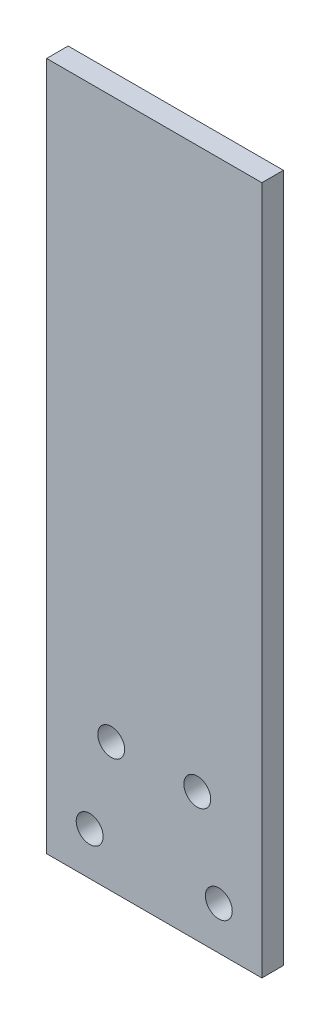
ISO-10303-21;
HEADER;
FILE_DESCRIPTION(('STEP AP214'),'2;1');
FILE_NAME('part.step','',(''),(''),'','','');
FILE_SCHEMA(('AUTOMOTIVE_DESIGN { 1 0 10303 214 1 1 1 1 }'));
ENDSEC;
DATA;
#1=APPLICATION_CONTEXT('core data for automotive mechanical design processes');
#2=APPLICATION_PROTOCOL_DEFINITION('international standard','automotive_design',2000,#1);
#3=PRODUCT_CONTEXT('',#1,'mechanical');
#4=PRODUCT('Part','Part','',(#3));
#5=PRODUCT_RELATED_PRODUCT_CATEGORY('part','',(#4));
#6=PRODUCT_DEFINITION_FORMATION('','',#4);
#7=PRODUCT_DEFINITION_CONTEXT('part definition',#1,'design');
#8=PRODUCT_DEFINITION('design','',#6,#7);
#9=PRODUCT_DEFINITION_SHAPE('','',#8);
#10=(LENGTH_UNIT() NAMED_UNIT(*) SI_UNIT(.MILLI.,.METRE.));
#11=(NAMED_UNIT(*) PLANE_ANGLE_UNIT() SI_UNIT($,.RADIAN.));
#12=(NAMED_UNIT(*) SI_UNIT($,.STERADIAN.) SOLID_ANGLE_UNIT());
#13=UNCERTAINTY_MEASURE_WITH_UNIT(LENGTH_MEASURE(1.E-05),#10,'distance_accuracy_value','');
#14=(GEOMETRIC_REPRESENTATION_CONTEXT(3) GLOBAL_UNCERTAINTY_ASSIGNED_CONTEXT((#13)) GLOBAL_UNIT_ASSIGNED_CONTEXT((#10,
#11,#12)) REPRESENTATION_CONTEXT('',''));
#15=CARTESIAN_POINT('',(0.,0.,0.));
#16=DIRECTION('',(0.,0.,1.));
#17=DIRECTION('',(1.,0.,0.));
#18=AXIS2_PLACEMENT_3D('',#15,#16,#17);
#19=CARTESIAN_POINT('',(-31.75,-101.6,3.175));
#20=DIRECTION('',(0.,1.,0.));
#21=DIRECTION('',(0.,0.,1.));
#22=AXIS2_PLACEMENT_3D('',#19,#20,#21);
#23=PLANE('',#22);
#24=DIRECTION('',(1.,0.,0.));
#25=VECTOR('',#24,1.);
#26=CARTESIAN_POINT('',(-31.75,-101.6,-3.175));
#27=LINE('',#26,#25);
#28=CARTESIAN_POINT('',(-31.75,-101.6,-3.175));
#29=VERTEX_POINT('',#28);
#30=CARTESIAN_POINT('',(31.75,-101.6,-3.175));
#31=VERTEX_POINT('',#30);
#32=EDGE_CURVE('E99',#29,#31,#27,.T.);
#33=ORIENTED_EDGE('',*,*,#32,.T.);
#34=DIRECTION('',(0.,0.,-1.));
#35=VECTOR('',#34,1.);
#36=CARTESIAN_POINT('',(31.75,-101.6,3.175));
#37=LINE('',#36,#35);
#38=CARTESIAN_POINT('',(31.75,-101.6,3.175));
#39=VERTEX_POINT('',#38);
#40=EDGE_CURVE('E11',#39,#31,#37,.T.);
#41=ORIENTED_EDGE('',*,*,#40,.F.);
#42=DIRECTION('',(1.,0.,0.));
#43=VECTOR('',#42,1.);
#44=CARTESIAN_POINT('',(-31.75,-101.6,3.175));
#45=LINE('',#44,#43);
#46=CARTESIAN_POINT('',(-31.75,-101.6,3.175));
#47=VERTEX_POINT('',#46);
#48=EDGE_CURVE('E85',#47,#39,#45,.T.);
#49=ORIENTED_EDGE('',*,*,#48,.F.);
#50=DIRECTION('',(0.,0.,-1.));
#51=VECTOR('',#50,1.);
#52=CARTESIAN_POINT('',(-31.75,-101.6,3.175));
#53=LINE('',#52,#51);
#54=EDGE_CURVE('E52',#47,#29,#53,.T.);
#55=ORIENTED_EDGE('',*,*,#54,.T.);
#56=EDGE_LOOP('',(#33,#41,#49,#55));
#57=FACE_BOUND('',#56,.T.);
#58=ADVANCED_FACE('F36',(#57),#23,.F.);
#59=CARTESIAN_POINT('',(31.75,-101.6,3.175));
#60=DIRECTION('',(-1.,0.,0.));
#61=DIRECTION('',(0.,0.,1.));
#62=AXIS2_PLACEMENT_3D('',#59,#60,#61);
#63=PLANE('',#62);
#64=DIRECTION('',(0.,1.,0.));
#65=VECTOR('',#64,1.);
#66=CARTESIAN_POINT('',(31.75,-101.6,-3.175));
#67=LINE('',#66,#65);
#68=CARTESIAN_POINT('',(31.75,101.6,-3.175));
#69=VERTEX_POINT('',#68);
#70=EDGE_CURVE('E90',#31,#69,#67,.T.);
#71=ORIENTED_EDGE('',*,*,#70,.T.);
#72=DIRECTION('',(0.,0.,-1.));
#73=VECTOR('',#72,1.);
#74=CARTESIAN_POINT('',(31.75,101.6,3.175));
#75=LINE('',#74,#73);
#76=CARTESIAN_POINT('',(31.75,101.6,3.175));
#77=VERTEX_POINT('',#76);
#78=EDGE_CURVE('E44',#77,#69,#75,.T.);
#79=ORIENTED_EDGE('',*,*,#78,.F.);
#80=DIRECTION('',(0.,1.,0.));
#81=VECTOR('',#80,1.);
#82=CARTESIAN_POINT('',(31.75,-101.6,3.175));
#83=LINE('',#82,#81);
#84=EDGE_CURVE('E77',#39,#77,#83,.T.);
#85=ORIENTED_EDGE('',*,*,#84,.F.);
#86=ORIENTED_EDGE('',*,*,#40,.T.);
#87=EDGE_LOOP('',(#71,#79,#85,#86));
#88=FACE_BOUND('',#87,.T.);
#89=ADVANCED_FACE('F89',(#88),#63,.F.);
#90=CARTESIAN_POINT('',(-31.75,101.6,3.175));
#91=DIRECTION('',(0.,1.,0.));
#92=DIRECTION('',(0.,0.,1.));
#93=AXIS2_PLACEMENT_3D('',#90,#91,#92);
#94=PLANE('',#93);
#95=DIRECTION('',(1.,0.,0.));
#96=VECTOR('',#95,1.);
#97=CARTESIAN_POINT('',(-31.75,101.6,-3.175));
#98=LINE('',#97,#96);
#99=CARTESIAN_POINT('',(-31.75,101.6,-3.175));
#100=VERTEX_POINT('',#99);
#101=EDGE_CURVE('E103',#100,#69,#98,.T.);
#102=ORIENTED_EDGE('',*,*,#101,.F.);
#103=DIRECTION('',(0.,0.,-1.));
#104=VECTOR('',#103,1.);
#105=CARTESIAN_POINT('',(-31.75,101.6,3.175));
#106=LINE('',#105,#104);
#107=CARTESIAN_POINT('',(-31.75,101.6,3.175));
#108=VERTEX_POINT('',#107);
#109=EDGE_CURVE('E66',#108,#100,#106,.T.);
#110=ORIENTED_EDGE('',*,*,#109,.F.);
#111=DIRECTION('',(1.,0.,0.));
#112=VECTOR('',#111,1.);
#113=CARTESIAN_POINT('',(-31.75,101.6,3.175));
#114=LINE('',#113,#112);
#115=EDGE_CURVE('E84',#108,#77,#114,.T.);
#116=ORIENTED_EDGE('',*,*,#115,.T.);
#117=ORIENTED_EDGE('',*,*,#78,.T.);
#118=EDGE_LOOP('',(#102,#110,#116,#117));
#119=FACE_BOUND('',#118,.T.);
#120=ADVANCED_FACE('F93',(#119),#94,.T.);
#121=CARTESIAN_POINT('',(-31.75,-101.6,3.175));
#122=DIRECTION('',(-1.,0.,0.));
#123=DIRECTION('',(0.,0.,1.));
#124=AXIS2_PLACEMENT_3D('',#121,#122,#123);
#125=PLANE('',#124);
#126=DIRECTION('',(0.,1.,0.));
#127=VECTOR('',#126,1.);
#128=CARTESIAN_POINT('',(-31.75,-101.6,-3.175));
#129=LINE('',#128,#127);
#130=EDGE_CURVE('E105',#29,#100,#129,.T.);
#131=ORIENTED_EDGE('',*,*,#130,.F.);
#132=ORIENTED_EDGE('',*,*,#54,.F.);
#133=DIRECTION('',(0.,1.,0.));
#134=VECTOR('',#133,1.);
#135=CARTESIAN_POINT('',(-31.75,-101.6,3.175));
#136=LINE('',#135,#134);
#137=EDGE_CURVE('E94',#47,#108,#136,.T.);
#138=ORIENTED_EDGE('',*,*,#137,.T.);
#139=ORIENTED_EDGE('',*,*,#109,.T.);
#140=EDGE_LOOP('',(#131,#132,#138,#139));
#141=FACE_BOUND('',#140,.T.);
#142=ADVANCED_FACE('F140',(#141),#125,.T.);
#143=CARTESIAN_POINT('',(0.,0.,3.175));
#144=DIRECTION('',(0.,0.,1.));
#145=DIRECTION('',(1.,0.,0.));
#146=AXIS2_PLACEMENT_3D('',#143,#144,#145);
#147=PLANE('',#146);
#148=CARTESIAN_POINT('',(-12.7,-63.5,3.175));
#149=DIRECTION('',(0.,0.,1.));
#150=DIRECTION('',(1.,0.,0.));
#151=AXIS2_PLACEMENT_3D('',#148,#149,#150);
#152=CIRCLE('',#151,3.96874999999999);
#153=CARTESIAN_POINT('',(-8.73125000000001,-63.5,3.175));
#154=VERTEX_POINT('',#153);
#155=EDGE_CURVE('E131',#154,#154,#152,.T.);
#156=ORIENTED_EDGE('',*,*,#155,.F.);
#157=EDGE_LOOP('',(#156));
#158=FACE_BOUND('',#157,.T.);
#159=CARTESIAN_POINT('',(12.7,-63.5,3.175));
#160=DIRECTION('',(0.,0.,1.));
#161=DIRECTION('',(1.,0.,0.));
#162=AXIS2_PLACEMENT_3D('',#159,#160,#161);
#163=CIRCLE('',#162,3.96874999999999);
#164=CARTESIAN_POINT('',(16.66875,-63.5,3.175));
#165=VERTEX_POINT('',#164);
#166=EDGE_CURVE('E125',#165,#165,#163,.T.);
#167=ORIENTED_EDGE('',*,*,#166,.F.);
#168=EDGE_LOOP('',(#167));
#169=FACE_BOUND('',#168,.T.);
#170=CARTESIAN_POINT('',(-19.05,-88.9,3.175));
#171=DIRECTION('',(0.,0.,1.));
#172=DIRECTION('',(1.,0.,0.));
#173=AXIS2_PLACEMENT_3D('',#170,#171,#172);
#174=CIRCLE('',#173,3.96874999999999);
#175=CARTESIAN_POINT('',(-15.08125,-88.9,3.175));
#176=VERTEX_POINT('',#175);
#177=EDGE_CURVE('E119',#176,#176,#174,.T.);
#178=ORIENTED_EDGE('',*,*,#177,.F.);
#179=EDGE_LOOP('',(#178));
#180=FACE_BOUND('',#179,.T.);
#181=CARTESIAN_POINT('',(19.05,-88.9,3.175));
#182=DIRECTION('',(0.,0.,1.));
#183=DIRECTION('',(1.,0.,0.));
#184=AXIS2_PLACEMENT_3D('',#181,#182,#183);
#185=CIRCLE('',#184,3.96874999999999);
#186=CARTESIAN_POINT('',(23.01875,-88.9,3.175));
#187=VERTEX_POINT('',#186);
#188=EDGE_CURVE('E113',#187,#187,#185,.T.);
#189=ORIENTED_EDGE('',*,*,#188,.F.);
#190=EDGE_LOOP('',(#189));
#191=FACE_BOUND('',#190,.T.);
#192=ORIENTED_EDGE('',*,*,#48,.T.);
#193=ORIENTED_EDGE('',*,*,#84,.T.);
#194=ORIENTED_EDGE('',*,*,#115,.F.);
#195=ORIENTED_EDGE('',*,*,#137,.F.);
#196=EDGE_LOOP('',(#192,#193,#194,#195));
#197=FACE_BOUND('',#196,.T.);
#198=ADVANCED_FACE('F81',(#158,#169,#180,#191,#197),#147,.T.);
#199=CARTESIAN_POINT('',(0.,0.,-3.175));
#200=DIRECTION('',(0.,0.,1.));
#201=DIRECTION('',(1.,0.,0.));
#202=AXIS2_PLACEMENT_3D('',#199,#200,#201);
#203=PLANE('',#202);
#204=CARTESIAN_POINT('',(-12.7,-63.5,-3.175));
#205=DIRECTION('',(0.,0.,1.));
#206=DIRECTION('',(1.,0.,0.));
#207=AXIS2_PLACEMENT_3D('',#204,#205,#206);
#208=CIRCLE('',#207,3.96875);
#209=CARTESIAN_POINT('',(-8.73125,-63.5,-3.175));
#210=VERTEX_POINT('',#209);
#211=EDGE_CURVE('E128',#210,#210,#208,.T.);
#212=ORIENTED_EDGE('',*,*,#211,.T.);
#213=EDGE_LOOP('',(#212));
#214=FACE_BOUND('',#213,.T.);
#215=CARTESIAN_POINT('',(12.7,-63.5,-3.175));
#216=DIRECTION('',(0.,0.,1.));
#217=DIRECTION('',(1.,0.,0.));
#218=AXIS2_PLACEMENT_3D('',#215,#216,#217);
#219=CIRCLE('',#218,3.96875);
#220=CARTESIAN_POINT('',(16.66875,-63.5,-3.175));
#221=VERTEX_POINT('',#220);
#222=EDGE_CURVE('E122',#221,#221,#219,.T.);
#223=ORIENTED_EDGE('',*,*,#222,.T.);
#224=EDGE_LOOP('',(#223));
#225=FACE_BOUND('',#224,.T.);
#226=CARTESIAN_POINT('',(-19.05,-88.9,-3.175));
#227=DIRECTION('',(0.,0.,1.));
#228=DIRECTION('',(1.,0.,0.));
#229=AXIS2_PLACEMENT_3D('',#226,#227,#228);
#230=CIRCLE('',#229,3.96875);
#231=CARTESIAN_POINT('',(-15.08125,-88.9,-3.175));
#232=VERTEX_POINT('',#231);
#233=EDGE_CURVE('E116',#232,#232,#230,.T.);
#234=ORIENTED_EDGE('',*,*,#233,.T.);
#235=EDGE_LOOP('',(#234));
#236=FACE_BOUND('',#235,.T.);
#237=CARTESIAN_POINT('',(19.05,-88.9,-3.175));
#238=DIRECTION('',(0.,0.,1.));
#239=DIRECTION('',(1.,0.,0.));
#240=AXIS2_PLACEMENT_3D('',#237,#238,#239);
#241=CIRCLE('',#240,3.96875);
#242=CARTESIAN_POINT('',(23.01875,-88.9,-3.175));
#243=VERTEX_POINT('',#242);
#244=EDGE_CURVE('E101',#243,#243,#241,.T.);
#245=ORIENTED_EDGE('',*,*,#244,.T.);
#246=EDGE_LOOP('',(#245));
#247=FACE_BOUND('',#246,.T.);
#248=ORIENTED_EDGE('',*,*,#32,.F.);
#249=ORIENTED_EDGE('',*,*,#130,.T.);
#250=ORIENTED_EDGE('',*,*,#101,.T.);
#251=ORIENTED_EDGE('',*,*,#70,.F.);
#252=EDGE_LOOP('',(#248,#249,#250,#251));
#253=FACE_BOUND('',#252,.T.);
#254=ADVANCED_FACE('F139',(#214,#225,#236,#247,#253),#203,.F.);
#255=CARTESIAN_POINT('',(19.05,-88.9,3.175));
#256=DIRECTION('',(0.,0.,1.));
#257=DIRECTION('',(1.,0.,0.));
#258=AXIS2_PLACEMENT_3D('',#255,#256,#257);
#259=CYLINDRICAL_SURFACE('',#258,3.96874999999999);
#260=ORIENTED_EDGE('',*,*,#244,.F.);
#261=EDGE_LOOP('',(#260));
#262=FACE_BOUND('',#261,.T.);
#263=ORIENTED_EDGE('',*,*,#188,.T.);
#264=EDGE_LOOP('',(#263));
#265=FACE_BOUND('',#264,.T.);
#266=ADVANCED_FACE('F148',(#262,#265),#259,.F.);
#267=CARTESIAN_POINT('',(-19.05,-88.9,3.175));
#268=DIRECTION('',(0.,0.,1.));
#269=DIRECTION('',(1.,0.,0.));
#270=AXIS2_PLACEMENT_3D('',#267,#268,#269);
#271=CYLINDRICAL_SURFACE('',#270,3.96874999999999);
#272=ORIENTED_EDGE('',*,*,#233,.F.);
#273=EDGE_LOOP('',(#272));
#274=FACE_BOUND('',#273,.T.);
#275=ORIENTED_EDGE('',*,*,#177,.T.);
#276=EDGE_LOOP('',(#275));
#277=FACE_BOUND('',#276,.T.);
#278=ADVANCED_FACE('F150',(#274,#277),#271,.F.);
#279=CARTESIAN_POINT('',(12.7,-63.5,3.175));
#280=DIRECTION('',(0.,0.,1.));
#281=DIRECTION('',(1.,0.,0.));
#282=AXIS2_PLACEMENT_3D('',#279,#280,#281);
#283=CYLINDRICAL_SURFACE('',#282,3.96874999999999);
#284=ORIENTED_EDGE('',*,*,#222,.F.);
#285=EDGE_LOOP('',(#284));
#286=FACE_BOUND('',#285,.T.);
#287=ORIENTED_EDGE('',*,*,#166,.T.);
#288=EDGE_LOOP('',(#287));
#289=FACE_BOUND('',#288,.T.);
#290=ADVANCED_FACE('F157',(#286,#289),#283,.F.);
#291=CARTESIAN_POINT('',(-12.7,-63.5,3.175));
#292=DIRECTION('',(0.,0.,1.));
#293=DIRECTION('',(1.,0.,0.));
#294=AXIS2_PLACEMENT_3D('',#291,#292,#293);
#295=CYLINDRICAL_SURFACE('',#294,3.96874999999999);
#296=ORIENTED_EDGE('',*,*,#211,.F.);
#297=EDGE_LOOP('',(#296));
#298=FACE_BOUND('',#297,.T.);
#299=ORIENTED_EDGE('',*,*,#155,.T.);
#300=EDGE_LOOP('',(#299));
#301=FACE_BOUND('',#300,.T.);
#302=ADVANCED_FACE('F135',(#298,#301),#295,.F.);
#303=CLOSED_SHELL('',(#58,#89,#120,#142,#198,#254,#266,#278,#290,#302));
#304=MANIFOLD_SOLID_BREP('B2',#303);
#305=ADVANCED_BREP_SHAPE_REPRESENTATION('',(#18,#304),#14);
#306=SHAPE_DEFINITION_REPRESENTATION(#9,#305);
ENDSEC;
END-ISO-10303-21;
